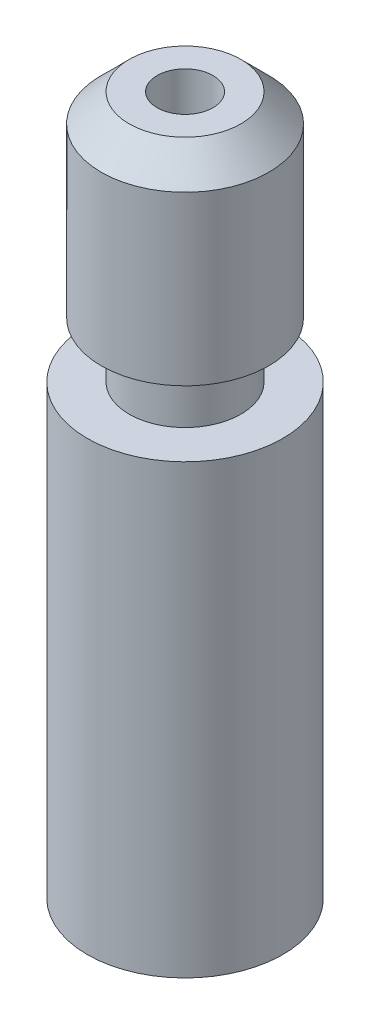
ISO-10303-21;
HEADER;
FILE_DESCRIPTION(('STEP AP214'),'2;1');
FILE_NAME('part.step','',(''),(''),'','','');
FILE_SCHEMA(('AUTOMOTIVE_DESIGN { 1 0 10303 214 1 1 1 1 }'));
ENDSEC;
DATA;
#1=APPLICATION_CONTEXT('core data for automotive mechanical design processes');
#2=APPLICATION_PROTOCOL_DEFINITION('international standard','automotive_design',2000,#1);
#3=PRODUCT_CONTEXT('',#1,'mechanical');
#4=PRODUCT('Part','Part','',(#3));
#5=PRODUCT_RELATED_PRODUCT_CATEGORY('part','',(#4));
#6=PRODUCT_DEFINITION_FORMATION('','',#4);
#7=PRODUCT_DEFINITION_CONTEXT('part definition',#1,'design');
#8=PRODUCT_DEFINITION('design','',#6,#7);
#9=PRODUCT_DEFINITION_SHAPE('','',#8);
#10=(LENGTH_UNIT() NAMED_UNIT(*) SI_UNIT(.MILLI.,.METRE.));
#11=(NAMED_UNIT(*) PLANE_ANGLE_UNIT() SI_UNIT($,.RADIAN.));
#12=(NAMED_UNIT(*) SI_UNIT($,.STERADIAN.) SOLID_ANGLE_UNIT());
#13=UNCERTAINTY_MEASURE_WITH_UNIT(LENGTH_MEASURE(1.E-05),#10,'distance_accuracy_value','');
#14=(GEOMETRIC_REPRESENTATION_CONTEXT(3) GLOBAL_UNCERTAINTY_ASSIGNED_CONTEXT((#13)) GLOBAL_UNIT_ASSIGNED_CONTEXT((#10,
#11,#12)) REPRESENTATION_CONTEXT('',''));
#15=CARTESIAN_POINT('',(0.,0.,0.));
#16=DIRECTION('',(0.,0.,1.));
#17=DIRECTION('',(1.,0.,0.));
#18=AXIS2_PLACEMENT_3D('',#15,#16,#17);
#19=CARTESIAN_POINT('',(0.,0.,0.));
#20=DIRECTION('',(0.,1.,0.));
#21=DIRECTION('',(0.,0.,1.));
#22=AXIS2_PLACEMENT_3D('',#19,#20,#21);
#23=CYLINDRICAL_SURFACE('',#22,1.);
#24=CARTESIAN_POINT('',(0.,25.,0.));
#25=DIRECTION('',(0.,1.,0.));
#26=DIRECTION('',(0.,0.,1.));
#27=AXIS2_PLACEMENT_3D('',#24,#25,#26);
#28=CIRCLE('',#27,1.);
#29=CARTESIAN_POINT('',(0.,25.,1.));
#30=VERTEX_POINT('',#29);
#31=EDGE_CURVE('E60',#30,#30,#28,.T.);
#32=ORIENTED_EDGE('',*,*,#31,.T.);
#33=EDGE_LOOP('',(#32));
#34=FACE_BOUND('',#33,.T.);
#35=CARTESIAN_POINT('',(0.,2.,0.));
#36=DIRECTION('',(0.,-1.,0.));
#37=DIRECTION('',(0.,0.,-1.));
#38=AXIS2_PLACEMENT_3D('',#35,#36,#37);
#39=CIRCLE('',#38,1.);
#40=CARTESIAN_POINT('',(0.,2.,-1.));
#41=VERTEX_POINT('',#40);
#42=EDGE_CURVE('E35',#41,#41,#39,.F.);
#43=ORIENTED_EDGE('',*,*,#42,.F.);
#44=EDGE_LOOP('',(#43));
#45=FACE_BOUND('',#44,.T.);
#46=ADVANCED_FACE('F31',(#34,#45),#23,.F.);
#47=CARTESIAN_POINT('',(0.,25.,0.));
#48=DIRECTION('',(0.,-1.,0.));
#49=DIRECTION('',(0.,0.,-1.));
#50=AXIS2_PLACEMENT_3D('',#47,#48,#49);
#51=CYLINDRICAL_SURFACE('',#50,2.);
#52=CARTESIAN_POINT('',(0.,16.,0.));
#53=DIRECTION('',(0.,1.,0.));
#54=DIRECTION('',(0.,0.,1.));
#55=AXIS2_PLACEMENT_3D('',#52,#53,#54);
#56=CIRCLE('',#55,2.);
#57=CARTESIAN_POINT('',(0.,16.,2.));
#58=VERTEX_POINT('',#57);
#59=EDGE_CURVE('E52',#58,#58,#56,.F.);
#60=ORIENTED_EDGE('',*,*,#59,.F.);
#61=EDGE_LOOP('',(#60));
#62=FACE_BOUND('',#61,.T.);
#63=CARTESIAN_POINT('',(0.,18.,0.));
#64=DIRECTION('',(0.,1.,0.));
#65=DIRECTION('',(0.,0.,1.));
#66=AXIS2_PLACEMENT_3D('',#63,#64,#65);
#67=CIRCLE('',#66,2.);
#68=CARTESIAN_POINT('',(0.,18.,2.));
#69=VERTEX_POINT('',#68);
#70=EDGE_CURVE('E43',#69,#69,#67,.T.);
#71=ORIENTED_EDGE('',*,*,#70,.F.);
#72=EDGE_LOOP('',(#71));
#73=FACE_BOUND('',#72,.T.);
#74=ADVANCED_FACE('F76',(#62,#73),#51,.T.);
#75=CARTESIAN_POINT('',(0.,16.,0.));
#76=DIRECTION('',(0.,1.,0.));
#77=DIRECTION('',(0.,0.,1.));
#78=AXIS2_PLACEMENT_3D('',#75,#76,#77);
#79=PLANE('',#78);
#80=CARTESIAN_POINT('',(0.,16.,0.));
#81=DIRECTION('',(0.,1.,0.));
#82=DIRECTION('',(0.,0.,1.));
#83=AXIS2_PLACEMENT_3D('',#80,#81,#82);
#84=CIRCLE('',#83,3.5);
#85=CARTESIAN_POINT('',(0.,16.,3.5));
#86=VERTEX_POINT('',#85);
#87=EDGE_CURVE('E48',#86,#86,#84,.T.);
#88=ORIENTED_EDGE('',*,*,#87,.T.);
#89=EDGE_LOOP('',(#88));
#90=FACE_BOUND('',#89,.T.);
#91=ORIENTED_EDGE('',*,*,#59,.T.);
#92=EDGE_LOOP('',(#91));
#93=FACE_BOUND('',#92,.T.);
#94=ADVANCED_FACE('F82',(#90,#93),#79,.T.);
#95=CARTESIAN_POINT('',(0.,16.,0.));
#96=DIRECTION('',(0.,-1.,0.));
#97=DIRECTION('',(0.,0.,-1.));
#98=AXIS2_PLACEMENT_3D('',#95,#96,#97);
#99=CYLINDRICAL_SURFACE('',#98,3.5);
#100=ORIENTED_EDGE('',*,*,#87,.F.);
#101=EDGE_LOOP('',(#100));
#102=FACE_BOUND('',#101,.T.);
#103=CARTESIAN_POINT('',(0.,0.,0.));
#104=DIRECTION('',(0.,1.,0.));
#105=DIRECTION('',(0.,0.,1.));
#106=AXIS2_PLACEMENT_3D('',#103,#104,#105);
#107=CIRCLE('',#106,3.5);
#108=CARTESIAN_POINT('',(0.,0.,3.5));
#109=VERTEX_POINT('',#108);
#110=EDGE_CURVE('E49',#109,#109,#107,.T.);
#111=ORIENTED_EDGE('',*,*,#110,.T.);
#112=EDGE_LOOP('',(#111));
#113=FACE_BOUND('',#112,.T.);
#114=ADVANCED_FACE('F103',(#102,#113),#99,.T.);
#115=CARTESIAN_POINT('',(0.,0.,0.));
#116=DIRECTION('',(0.,1.,0.));
#117=DIRECTION('',(0.,0.,1.));
#118=AXIS2_PLACEMENT_3D('',#115,#116,#117);
#119=PLANE('',#118);
#120=CARTESIAN_POINT('',(0.,0.,0.));
#121=DIRECTION('',(0.,-1.,0.));
#122=DIRECTION('',(0.,0.,-1.));
#123=AXIS2_PLACEMENT_3D('',#120,#121,#122);
#124=CIRCLE('',#123,2.);
#125=CARTESIAN_POINT('',(0.,0.,-2.));
#126=VERTEX_POINT('',#125);
#127=EDGE_CURVE('E63',#126,#126,#124,.T.);
#128=ORIENTED_EDGE('',*,*,#127,.F.);
#129=EDGE_LOOP('',(#128));
#130=FACE_BOUND('',#129,.T.);
#131=ORIENTED_EDGE('',*,*,#110,.F.);
#132=EDGE_LOOP('',(#131));
#133=FACE_BOUND('',#132,.T.);
#134=ADVANCED_FACE('F93',(#130,#133),#119,.F.);
#135=CARTESIAN_POINT('',(0.,18.,0.));
#136=DIRECTION('',(0.,1.,0.));
#137=DIRECTION('',(0.,0.,1.));
#138=AXIS2_PLACEMENT_3D('',#135,#136,#137);
#139=PLANE('',#138);
#140=CARTESIAN_POINT('',(0.,18.,0.));
#141=DIRECTION('',(0.,1.,0.));
#142=DIRECTION('',(0.,0.,1.));
#143=AXIS2_PLACEMENT_3D('',#140,#141,#142);
#144=CIRCLE('',#143,3.);
#145=CARTESIAN_POINT('',(0.,18.,3.));
#146=VERTEX_POINT('',#145);
#147=EDGE_CURVE('E57',#146,#146,#144,.T.);
#148=ORIENTED_EDGE('',*,*,#147,.F.);
#149=EDGE_LOOP('',(#148));
#150=FACE_BOUND('',#149,.T.);
#151=ORIENTED_EDGE('',*,*,#70,.T.);
#152=EDGE_LOOP('',(#151));
#153=FACE_BOUND('',#152,.T.);
#154=ADVANCED_FACE('F89',(#150,#153),#139,.F.);
#155=CARTESIAN_POINT('',(0.,18.,0.));
#156=DIRECTION('',(0.,1.,0.));
#157=DIRECTION('',(0.,0.,1.));
#158=AXIS2_PLACEMENT_3D('',#155,#156,#157);
#159=CYLINDRICAL_SURFACE('',#158,3.);
#160=CARTESIAN_POINT('',(0.,24.,0.));
#161=DIRECTION('',(0.,1.,0.));
#162=DIRECTION('',(0.,0.,1.));
#163=AXIS2_PLACEMENT_3D('',#160,#161,#162);
#164=CIRCLE('',#163,3.);
#165=CARTESIAN_POINT('',(0.,24.,3.));
#166=VERTEX_POINT('',#165);
#167=EDGE_CURVE('E10',#166,#166,#164,.F.);
#168=ORIENTED_EDGE('',*,*,#167,.T.);
#169=EDGE_LOOP('',(#168));
#170=FACE_BOUND('',#169,.T.);
#171=ORIENTED_EDGE('',*,*,#147,.T.);
#172=EDGE_LOOP('',(#171));
#173=FACE_BOUND('',#172,.T.);
#174=ADVANCED_FACE('F92',(#170,#173),#159,.T.);
#175=CARTESIAN_POINT('',(0.,25.,0.));
#176=DIRECTION('',(0.,1.,0.));
#177=DIRECTION('',(0.,0.,1.));
#178=AXIS2_PLACEMENT_3D('',#175,#176,#177);
#179=PLANE('',#178);
#180=ORIENTED_EDGE('',*,*,#31,.F.);
#181=EDGE_LOOP('',(#180));
#182=FACE_BOUND('',#181,.T.);
#183=CARTESIAN_POINT('',(0.,25.,0.));
#184=DIRECTION('',(0.,1.,0.));
#185=DIRECTION('',(0.,0.,1.));
#186=AXIS2_PLACEMENT_3D('',#183,#184,#185);
#187=CIRCLE('',#186,2.);
#188=CARTESIAN_POINT('',(0.,25.,2.));
#189=VERTEX_POINT('',#188);
#190=EDGE_CURVE('E39',#189,#189,#187,.T.);
#191=ORIENTED_EDGE('',*,*,#190,.T.);
#192=EDGE_LOOP('',(#191));
#193=FACE_BOUND('',#192,.T.);
#194=ADVANCED_FACE('F97',(#182,#193),#179,.T.);
#195=CARTESIAN_POINT('',(0.,25.,0.));
#196=DIRECTION('',(0.,-1.,0.));
#197=DIRECTION('',(0.,0.,-1.));
#198=AXIS2_PLACEMENT_3D('',#195,#196,#197);
#199=CONICAL_SURFACE('',#198,2.,0.785398163397447);
#200=ORIENTED_EDGE('',*,*,#167,.F.);
#201=EDGE_LOOP('',(#200));
#202=FACE_BOUND('',#201,.T.);
#203=ORIENTED_EDGE('',*,*,#190,.F.);
#204=EDGE_LOOP('',(#203));
#205=FACE_BOUND('',#204,.T.);
#206=ADVANCED_FACE('F33',(#202,#205),#199,.T.);
#207=CARTESIAN_POINT('',(0.,2.,0.));
#208=DIRECTION('',(0.,-1.,0.));
#209=DIRECTION('',(0.,0.,-1.));
#210=AXIS2_PLACEMENT_3D('',#207,#208,#209);
#211=PLANE('',#210);
#212=CARTESIAN_POINT('',(0.,2.,0.));
#213=DIRECTION('',(0.,-1.,0.));
#214=DIRECTION('',(0.,0.,-1.));
#215=AXIS2_PLACEMENT_3D('',#212,#213,#214);
#216=CIRCLE('',#215,2.);
#217=CARTESIAN_POINT('',(0.,2.,-2.));
#218=VERTEX_POINT('',#217);
#219=EDGE_CURVE('E66',#218,#218,#216,.T.);
#220=ORIENTED_EDGE('',*,*,#219,.T.);
#221=EDGE_LOOP('',(#220));
#222=FACE_BOUND('',#221,.T.);
#223=ORIENTED_EDGE('',*,*,#42,.T.);
#224=EDGE_LOOP('',(#223));
#225=FACE_BOUND('',#224,.T.);
#226=ADVANCED_FACE('F73',(#222,#225),#211,.T.);
#227=CARTESIAN_POINT('',(0.,2.,0.));
#228=DIRECTION('',(0.,-1.,0.));
#229=DIRECTION('',(0.,0.,-1.));
#230=AXIS2_PLACEMENT_3D('',#227,#228,#229);
#231=CYLINDRICAL_SURFACE('',#230,2.);
#232=ORIENTED_EDGE('',*,*,#219,.F.);
#233=EDGE_LOOP('',(#232));
#234=FACE_BOUND('',#233,.T.);
#235=ORIENTED_EDGE('',*,*,#127,.T.);
#236=EDGE_LOOP('',(#235));
#237=FACE_BOUND('',#236,.T.);
#238=ADVANCED_FACE('F87',(#234,#237),#231,.F.);
#239=CLOSED_SHELL('',(#46,#74,#94,#114,#134,#154,#174,#194,#206,#226,#238));
#240=MANIFOLD_SOLID_BREP('B2',#239);
#241=ADVANCED_BREP_SHAPE_REPRESENTATION('',(#18,#240),#14);
#242=SHAPE_DEFINITION_REPRESENTATION(#9,#241);
ENDSEC;
END-ISO-10303-21;
